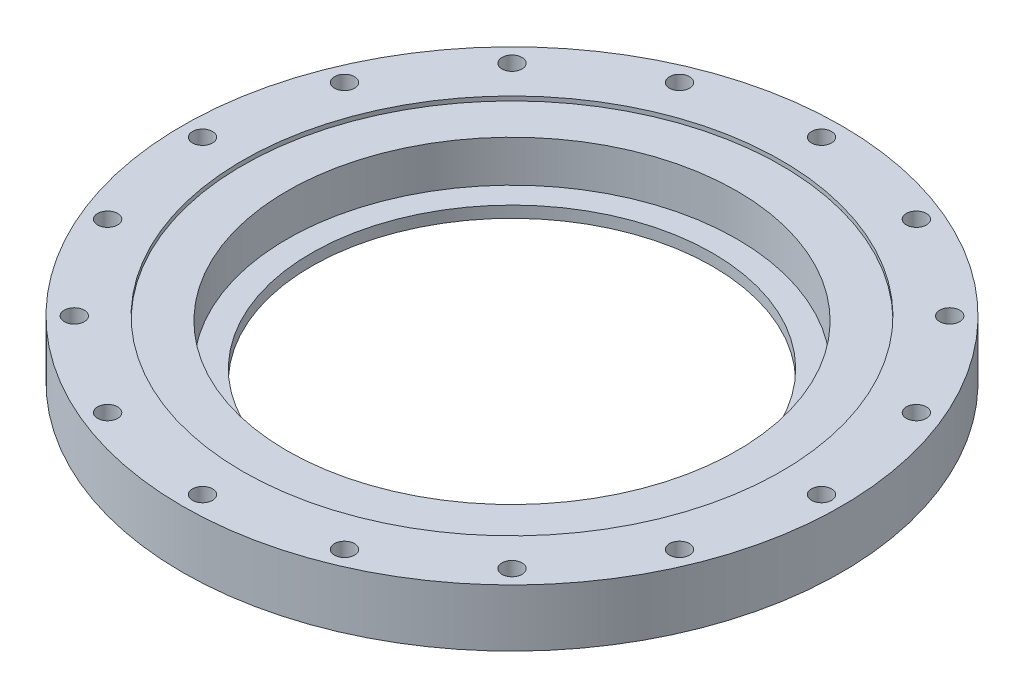
ISO-10303-21;
HEADER;
FILE_DESCRIPTION(('STEP AP214'),'2;1');
FILE_NAME('part.step','',(''),(''),'','','');
FILE_SCHEMA(('AUTOMOTIVE_DESIGN { 1 0 10303 214 1 1 1 1 }'));
ENDSEC;
DATA;
#1=APPLICATION_CONTEXT('core data for automotive mechanical design processes');
#2=APPLICATION_PROTOCOL_DEFINITION('international standard','automotive_design',2000,#1);
#3=PRODUCT_CONTEXT('',#1,'mechanical');
#4=PRODUCT('Part','Part','',(#3));
#5=PRODUCT_RELATED_PRODUCT_CATEGORY('part','',(#4));
#6=PRODUCT_DEFINITION_FORMATION('','',#4);
#7=PRODUCT_DEFINITION_CONTEXT('part definition',#1,'design');
#8=PRODUCT_DEFINITION('design','',#6,#7);
#9=PRODUCT_DEFINITION_SHAPE('','',#8);
#10=(LENGTH_UNIT() NAMED_UNIT(*) SI_UNIT(.MILLI.,.METRE.));
#11=(NAMED_UNIT(*) PLANE_ANGLE_UNIT() SI_UNIT($,.RADIAN.));
#12=(NAMED_UNIT(*) SI_UNIT($,.STERADIAN.) SOLID_ANGLE_UNIT());
#13=UNCERTAINTY_MEASURE_WITH_UNIT(LENGTH_MEASURE(1.E-05),#10,'distance_accuracy_value','');
#14=(GEOMETRIC_REPRESENTATION_CONTEXT(3) GLOBAL_UNCERTAINTY_ASSIGNED_CONTEXT((#13)) GLOBAL_UNIT_ASSIGNED_CONTEXT((#10,
#11,#12)) REPRESENTATION_CONTEXT('',''));
#15=CARTESIAN_POINT('',(0.,0.,0.));
#16=DIRECTION('',(0.,0.,1.));
#17=DIRECTION('',(1.,0.,0.));
#18=AXIS2_PLACEMENT_3D('',#15,#16,#17);
#19=CARTESIAN_POINT('',(0.,10.,0.));
#20=DIRECTION('',(0.,-1.,0.));
#21=DIRECTION('',(0.,0.,-1.));
#22=AXIS2_PLACEMENT_3D('',#19,#20,#21);
#23=CYLINDRICAL_SURFACE('',#22,39.25);
#24=CARTESIAN_POINT('',(0.,9.25,0.));
#25=DIRECTION('',(0.,1.,0.));
#26=DIRECTION('',(0.,0.,1.));
#27=AXIS2_PLACEMENT_3D('',#24,#25,#26);
#28=CIRCLE('',#27,39.25);
#29=CARTESIAN_POINT('',(0.,9.25,39.25));
#30=VERTEX_POINT('',#29);
#31=EDGE_CURVE('E35',#30,#30,#28,.T.);
#32=ORIENTED_EDGE('',*,*,#31,.T.);
#33=EDGE_LOOP('',(#32));
#34=FACE_BOUND('',#33,.T.);
#35=CARTESIAN_POINT('',(0.,2.,0.));
#36=DIRECTION('',(0.,-1.,0.));
#37=DIRECTION('',(0.,0.,-1.));
#38=AXIS2_PLACEMENT_3D('',#35,#36,#37);
#39=CIRCLE('',#38,39.25);
#40=CARTESIAN_POINT('',(0.,2.,-39.25));
#41=VERTEX_POINT('',#40);
#42=EDGE_CURVE('E151',#41,#41,#39,.T.);
#43=ORIENTED_EDGE('',*,*,#42,.T.);
#44=EDGE_LOOP('',(#43));
#45=FACE_BOUND('',#44,.T.);
#46=ADVANCED_FACE('F31',(#34,#45),#23,.F.);
#47=CARTESIAN_POINT('',(0.,10.,0.));
#48=DIRECTION('',(0.,1.,0.));
#49=DIRECTION('',(0.,0.,1.));
#50=AXIS2_PLACEMENT_3D('',#47,#48,#49);
#51=PLANE('',#50);
#52=CARTESIAN_POINT('',(0.,10.,0.));
#53=DIRECTION('',(0.,1.,0.));
#54=DIRECTION('',(0.,0.,1.));
#55=AXIS2_PLACEMENT_3D('',#52,#53,#54);
#56=CIRCLE('',#55,47.);
#57=CARTESIAN_POINT('',(0.,10.,47.));
#58=VERTEX_POINT('',#57);
#59=EDGE_CURVE('E163',#58,#58,#56,.T.);
#60=ORIENTED_EDGE('',*,*,#59,.F.);
#61=EDGE_LOOP('',(#60));
#62=FACE_BOUND('',#61,.T.);
#63=CARTESIAN_POINT('',(0.,10.,-54.));
#64=DIRECTION('',(0.,1.,0.));
#65=DIRECTION('',(0.,0.,1.));
#66=AXIS2_PLACEMENT_3D('',#63,#64,#65);
#67=CIRCLE('',#66,1.75);
#68=CARTESIAN_POINT('',(0.,10.,-52.25));
#69=VERTEX_POINT('',#68);
#70=EDGE_CURVE('E54',#69,#69,#67,.T.);
#71=ORIENTED_EDGE('',*,*,#70,.F.);
#72=EDGE_LOOP('',(#71));
#73=FACE_BOUND('',#72,.T.);
#74=CARTESIAN_POINT('',(20.6649053477149,10.,-49.8894947556095));
#75=DIRECTION('',(0.,1.,0.));
#76=DIRECTION('',(0.,0.,1.));
#77=AXIS2_PLACEMENT_3D('',#74,#75,#76);
#78=CIRCLE('',#77,1.75);
#79=CARTESIAN_POINT('',(20.6649053477149,10.,-48.1394947556095));
#80=VERTEX_POINT('',#79);
#81=EDGE_CURVE('E168',#80,#80,#78,.T.);
#82=ORIENTED_EDGE('',*,*,#81,.F.);
#83=EDGE_LOOP('',(#82));
#84=FACE_BOUND('',#83,.T.);
#85=CARTESIAN_POINT('',(38.1837661840742,10.,-38.1837661840752));
#86=DIRECTION('',(0.,1.,0.));
#87=DIRECTION('',(0.,0.,1.));
#88=AXIS2_PLACEMENT_3D('',#85,#86,#87);
#89=CIRCLE('',#88,1.75);
#90=CARTESIAN_POINT('',(38.1837661840742,10.,-36.4337661840752));
#91=VERTEX_POINT('',#90);
#92=EDGE_CURVE('E171',#91,#91,#89,.T.);
#93=ORIENTED_EDGE('',*,*,#92,.F.);
#94=EDGE_LOOP('',(#93));
#95=FACE_BOUND('',#94,.T.);
#96=CARTESIAN_POINT('',(49.8894947556109,10.,-20.664905347717));
#97=DIRECTION('',(0.,1.,0.));
#98=DIRECTION('',(0.,0.,1.));
#99=AXIS2_PLACEMENT_3D('',#96,#97,#98);
#100=CIRCLE('',#99,1.75);
#101=CARTESIAN_POINT('',(49.8894947556109,10.,-18.914905347717));
#102=VERTEX_POINT('',#101);
#103=EDGE_CURVE('E174',#102,#102,#100,.T.);
#104=ORIENTED_EDGE('',*,*,#103,.F.);
#105=EDGE_LOOP('',(#104));
#106=FACE_BOUND('',#105,.T.);
#107=CARTESIAN_POINT('',(54.0000000000023,10.,-2.29223882478963E-12));
#108=DIRECTION('',(0.,1.,0.));
#109=DIRECTION('',(0.,0.,1.));
#110=AXIS2_PLACEMENT_3D('',#107,#108,#109);
#111=CIRCLE('',#110,1.75);
#112=CARTESIAN_POINT('',(54.0000000000023,10.,1.74999999999771));
#113=VERTEX_POINT('',#112);
#114=EDGE_CURVE('E177',#113,#113,#111,.T.);
#115=ORIENTED_EDGE('',*,*,#114,.F.);
#116=EDGE_LOOP('',(#115));
#117=FACE_BOUND('',#116,.T.);
#118=CARTESIAN_POINT('',(49.8894947556126,10.,20.6649053477127));
#119=DIRECTION('',(0.,1.,0.));
#120=DIRECTION('',(0.,0.,1.));
#121=AXIS2_PLACEMENT_3D('',#118,#119,#120);
#122=CIRCLE('',#121,1.75);
#123=CARTESIAN_POINT('',(49.8894947556126,10.,22.4149053477127));
#124=VERTEX_POINT('',#123);
#125=EDGE_CURVE('E180',#124,#124,#122,.T.);
#126=ORIENTED_EDGE('',*,*,#125,.F.);
#127=EDGE_LOOP('',(#126));
#128=FACE_BOUND('',#127,.T.);
#129=CARTESIAN_POINT('',(38.1837661840775,10.,38.1837661840719));
#130=DIRECTION('',(0.,1.,0.));
#131=DIRECTION('',(0.,0.,1.));
#132=AXIS2_PLACEMENT_3D('',#129,#130,#131);
#133=CIRCLE('',#132,1.75);
#134=CARTESIAN_POINT('',(38.1837661840775,10.,39.9337661840719));
#135=VERTEX_POINT('',#134);
#136=EDGE_CURVE('E183',#135,#135,#133,.T.);
#137=ORIENTED_EDGE('',*,*,#136,.F.);
#138=EDGE_LOOP('',(#137));
#139=FACE_BOUND('',#138,.T.);
#140=CARTESIAN_POINT('',(20.6649053477193,10.,49.8894947556086));
#141=DIRECTION('',(0.,1.,0.));
#142=DIRECTION('',(0.,0.,1.));
#143=AXIS2_PLACEMENT_3D('',#140,#141,#142);
#144=CIRCLE('',#143,1.75);
#145=CARTESIAN_POINT('',(20.6649053477193,10.,51.6394947556086));
#146=VERTEX_POINT('',#145);
#147=EDGE_CURVE('E186',#146,#146,#144,.T.);
#148=ORIENTED_EDGE('',*,*,#147,.F.);
#149=EDGE_LOOP('',(#148));
#150=FACE_BOUND('',#149,.T.);
#151=CARTESIAN_POINT('',(4.58447764957926E-12,10.,54.));
#152=DIRECTION('',(0.,1.,0.));
#153=DIRECTION('',(0.,0.,1.));
#154=AXIS2_PLACEMENT_3D('',#151,#152,#153);
#155=CIRCLE('',#154,1.75);
#156=CARTESIAN_POINT('',(4.58447764957926E-12,10.,55.75));
#157=VERTEX_POINT('',#156);
#158=EDGE_CURVE('E189',#157,#157,#155,.T.);
#159=ORIENTED_EDGE('',*,*,#158,.F.);
#160=EDGE_LOOP('',(#159));
#161=FACE_BOUND('',#160,.T.);
#162=CARTESIAN_POINT('',(-20.6649053477104,10.,49.8894947556104));
#163=DIRECTION('',(0.,1.,0.));
#164=DIRECTION('',(0.,0.,1.));
#165=AXIS2_PLACEMENT_3D('',#162,#163,#164);
#166=CIRCLE('',#165,1.75);
#167=CARTESIAN_POINT('',(-20.6649053477104,10.,51.6394947556104));
#168=VERTEX_POINT('',#167);
#169=EDGE_CURVE('E192',#168,#168,#166,.T.);
#170=ORIENTED_EDGE('',*,*,#169,.F.);
#171=EDGE_LOOP('',(#170));
#172=FACE_BOUND('',#171,.T.);
#173=CARTESIAN_POINT('',(-38.1837661840697,10.,38.1837661840752));
#174=DIRECTION('',(0.,1.,0.));
#175=DIRECTION('',(0.,0.,1.));
#176=AXIS2_PLACEMENT_3D('',#173,#174,#175);
#177=CIRCLE('',#176,1.75);
#178=CARTESIAN_POINT('',(-38.1837661840697,10.,39.9337661840752));
#179=VERTEX_POINT('',#178);
#180=EDGE_CURVE('E195',#179,#179,#177,.T.);
#181=ORIENTED_EDGE('',*,*,#180,.F.);
#182=EDGE_LOOP('',(#181));
#183=FACE_BOUND('',#182,.T.);
#184=CARTESIAN_POINT('',(-49.8894947556063,10.,20.664905347717));
#185=DIRECTION('',(0.,1.,0.));
#186=DIRECTION('',(0.,0.,1.));
#187=AXIS2_PLACEMENT_3D('',#184,#185,#186);
#188=CIRCLE('',#187,1.75);
#189=CARTESIAN_POINT('',(-49.8894947556063,10.,22.414905347717));
#190=VERTEX_POINT('',#189);
#191=EDGE_CURVE('E198',#190,#190,#188,.T.);
#192=ORIENTED_EDGE('',*,*,#191,.F.);
#193=EDGE_LOOP('',(#192));
#194=FACE_BOUND('',#193,.T.);
#195=CARTESIAN_POINT('',(-53.9999999999977,10.,2.29885191750503E-12));
#196=DIRECTION('',(0.,1.,0.));
#197=DIRECTION('',(0.,0.,1.));
#198=AXIS2_PLACEMENT_3D('',#195,#196,#197);
#199=CIRCLE('',#198,1.75);
#200=CARTESIAN_POINT('',(-53.9999999999977,10.,1.7500000000023));
#201=VERTEX_POINT('',#200);
#202=EDGE_CURVE('E201',#201,#201,#199,.T.);
#203=ORIENTED_EDGE('',*,*,#202,.F.);
#204=EDGE_LOOP('',(#203));
#205=FACE_BOUND('',#204,.T.);
#206=CARTESIAN_POINT('',(-49.8894947556081,10.,-20.6649053477127));
#207=DIRECTION('',(0.,1.,0.));
#208=DIRECTION('',(0.,0.,1.));
#209=AXIS2_PLACEMENT_3D('',#206,#207,#208);
#210=CIRCLE('',#209,1.75);
#211=CARTESIAN_POINT('',(-49.8894947556081,10.,-18.9149053477127));
#212=VERTEX_POINT('',#211);
#213=EDGE_CURVE('E204',#212,#212,#210,.T.);
#214=ORIENTED_EDGE('',*,*,#213,.F.);
#215=EDGE_LOOP('',(#214));
#216=FACE_BOUND('',#215,.T.);
#217=CARTESIAN_POINT('',(-38.1837661840729,10.,-38.1837661840719));
#218=DIRECTION('',(0.,1.,0.));
#219=DIRECTION('',(0.,0.,1.));
#220=AXIS2_PLACEMENT_3D('',#217,#218,#219);
#221=CIRCLE('',#220,1.75);
#222=CARTESIAN_POINT('',(-38.1837661840729,10.,-36.4337661840719));
#223=VERTEX_POINT('',#222);
#224=EDGE_CURVE('E206',#223,#223,#221,.T.);
#225=ORIENTED_EDGE('',*,*,#224,.F.);
#226=EDGE_LOOP('',(#225));
#227=FACE_BOUND('',#226,.T.);
#228=CARTESIAN_POINT('',(-20.6649053477147,10.,-49.8894947556086));
#229=DIRECTION('',(0.,1.,0.));
#230=DIRECTION('',(0.,0.,1.));
#231=AXIS2_PLACEMENT_3D('',#228,#229,#230);
#232=CIRCLE('',#231,1.75);
#233=CARTESIAN_POINT('',(-20.6649053477147,10.,-48.1394947556086));
#234=VERTEX_POINT('',#233);
#235=EDGE_CURVE('E47',#234,#234,#232,.T.);
#236=ORIENTED_EDGE('',*,*,#235,.F.);
#237=EDGE_LOOP('',(#236));
#238=FACE_BOUND('',#237,.T.);
#239=CARTESIAN_POINT('',(0.,10.,0.));
#240=DIRECTION('',(0.,1.,0.));
#241=DIRECTION('',(0.,0.,1.));
#242=AXIS2_PLACEMENT_3D('',#239,#240,#241);
#243=CIRCLE('',#242,57.5);
#244=CARTESIAN_POINT('',(0.,10.,57.5));
#245=VERTEX_POINT('',#244);
#246=EDGE_CURVE('E10',#245,#245,#243,.T.);
#247=ORIENTED_EDGE('',*,*,#246,.T.);
#248=EDGE_LOOP('',(#247));
#249=FACE_BOUND('',#248,.T.);
#250=ADVANCED_FACE('F119',(#62,#73,#84,#95,#106,#117,#128,#139,#150,#161,#172,#183,#194,#205,
#216,#227,#238,#249),#51,.T.);
#251=CARTESIAN_POINT('',(0.,0.,0.));
#252=DIRECTION('',(0.,1.,0.));
#253=DIRECTION('',(0.,0.,1.));
#254=AXIS2_PLACEMENT_3D('',#251,#252,#253);
#255=PLANE('',#254);
#256=CARTESIAN_POINT('',(1.57116660247941E-13,0.,45.));
#257=DIRECTION('',(0.,-1.,0.));
#258=DIRECTION('',(0.,0.,-1.));
#259=AXIS2_PLACEMENT_3D('',#256,#257,#258);
#260=CIRCLE('',#259,2.);
#261=CARTESIAN_POINT('',(1.57116660247941E-13,0.,43.));
#262=VERTEX_POINT('',#261);
#263=EDGE_CURVE('E141',#262,#262,#260,.T.);
#264=ORIENTED_EDGE('',*,*,#263,.F.);
#265=EDGE_LOOP('',(#264));
#266=FACE_BOUND('',#265,.T.);
#267=CARTESIAN_POINT('',(38.9711431703025,0.,-22.4999999999985));
#268=DIRECTION('',(0.,-1.,0.));
#269=DIRECTION('',(0.,0.,-1.));
#270=AXIS2_PLACEMENT_3D('',#267,#268,#269);
#271=CIRCLE('',#270,2.);
#272=CARTESIAN_POINT('',(38.9711431703025,0.,-24.4999999999985));
#273=VERTEX_POINT('',#272);
#274=EDGE_CURVE('E145',#273,#273,#271,.T.);
#275=ORIENTED_EDGE('',*,*,#274,.F.);
#276=EDGE_LOOP('',(#275));
#277=FACE_BOUND('',#276,.T.);
#278=CARTESIAN_POINT('',(-38.9711431702969,0.,-22.5000000000015));
#279=DIRECTION('',(0.,-1.,0.));
#280=DIRECTION('',(0.,0.,-1.));
#281=AXIS2_PLACEMENT_3D('',#278,#279,#280);
#282=CIRCLE('',#281,2.);
#283=CARTESIAN_POINT('',(-38.9711431702969,0.,-24.5000000000015));
#284=VERTEX_POINT('',#283);
#285=EDGE_CURVE('E148',#284,#284,#282,.T.);
#286=ORIENTED_EDGE('',*,*,#285,.F.);
#287=EDGE_LOOP('',(#286));
#288=FACE_BOUND('',#287,.T.);
#289=CARTESIAN_POINT('',(0.,0.,-54.));
#290=DIRECTION('',(0.,1.,0.));
#291=DIRECTION('',(0.,0.,1.));
#292=AXIS2_PLACEMENT_3D('',#289,#290,#291);
#293=CIRCLE('',#292,1.75);
#294=CARTESIAN_POINT('',(0.,0.,-52.25));
#295=VERTEX_POINT('',#294);
#296=EDGE_CURVE('E44',#295,#295,#293,.T.);
#297=ORIENTED_EDGE('',*,*,#296,.T.);
#298=EDGE_LOOP('',(#297));
#299=FACE_BOUND('',#298,.T.);
#300=CARTESIAN_POINT('',(20.6649053477149,0.,-49.8894947556095));
#301=DIRECTION('',(0.,1.,0.));
#302=DIRECTION('',(0.,0.,1.));
#303=AXIS2_PLACEMENT_3D('',#300,#301,#302);
#304=CIRCLE('',#303,1.75);
#305=CARTESIAN_POINT('',(20.6649053477149,0.,-48.1394947556095));
#306=VERTEX_POINT('',#305);
#307=EDGE_CURVE('E93',#306,#306,#304,.T.);
#308=ORIENTED_EDGE('',*,*,#307,.T.);
#309=EDGE_LOOP('',(#308));
#310=FACE_BOUND('',#309,.T.);
#311=CARTESIAN_POINT('',(38.1837661840742,0.,-38.1837661840752));
#312=DIRECTION('',(0.,1.,0.));
#313=DIRECTION('',(0.,0.,1.));
#314=AXIS2_PLACEMENT_3D('',#311,#312,#313);
#315=CIRCLE('',#314,1.75);
#316=CARTESIAN_POINT('',(38.1837661840742,0.,-36.4337661840752));
#317=VERTEX_POINT('',#316);
#318=EDGE_CURVE('E90',#317,#317,#315,.T.);
#319=ORIENTED_EDGE('',*,*,#318,.T.);
#320=EDGE_LOOP('',(#319));
#321=FACE_BOUND('',#320,.T.);
#322=CARTESIAN_POINT('',(49.8894947556109,0.,-20.664905347717));
#323=DIRECTION('',(0.,1.,0.));
#324=DIRECTION('',(0.,0.,1.));
#325=AXIS2_PLACEMENT_3D('',#322,#323,#324);
#326=CIRCLE('',#325,1.75);
#327=CARTESIAN_POINT('',(49.8894947556109,0.,-18.914905347717));
#328=VERTEX_POINT('',#327);
#329=EDGE_CURVE('E87',#328,#328,#326,.T.);
#330=ORIENTED_EDGE('',*,*,#329,.T.);
#331=EDGE_LOOP('',(#330));
#332=FACE_BOUND('',#331,.T.);
#333=CARTESIAN_POINT('',(54.0000000000023,0.,-2.29223882478963E-12));
#334=DIRECTION('',(0.,1.,0.));
#335=DIRECTION('',(0.,0.,1.));
#336=AXIS2_PLACEMENT_3D('',#333,#334,#335);
#337=CIRCLE('',#336,1.75);
#338=CARTESIAN_POINT('',(54.0000000000023,0.,1.74999999999771));
#339=VERTEX_POINT('',#338);
#340=EDGE_CURVE('E84',#339,#339,#337,.T.);
#341=ORIENTED_EDGE('',*,*,#340,.T.);
#342=EDGE_LOOP('',(#341));
#343=FACE_BOUND('',#342,.T.);
#344=CARTESIAN_POINT('',(49.8894947556126,0.,20.6649053477127));
#345=DIRECTION('',(0.,1.,0.));
#346=DIRECTION('',(0.,0.,1.));
#347=AXIS2_PLACEMENT_3D('',#344,#345,#346);
#348=CIRCLE('',#347,1.75);
#349=CARTESIAN_POINT('',(49.8894947556126,0.,22.4149053477127));
#350=VERTEX_POINT('',#349);
#351=EDGE_CURVE('E81',#350,#350,#348,.T.);
#352=ORIENTED_EDGE('',*,*,#351,.T.);
#353=EDGE_LOOP('',(#352));
#354=FACE_BOUND('',#353,.T.);
#355=CARTESIAN_POINT('',(38.1837661840775,0.,38.1837661840719));
#356=DIRECTION('',(0.,1.,0.));
#357=DIRECTION('',(0.,0.,1.));
#358=AXIS2_PLACEMENT_3D('',#355,#356,#357);
#359=CIRCLE('',#358,1.75);
#360=CARTESIAN_POINT('',(38.1837661840775,0.,39.9337661840719));
#361=VERTEX_POINT('',#360);
#362=EDGE_CURVE('E78',#361,#361,#359,.T.);
#363=ORIENTED_EDGE('',*,*,#362,.T.);
#364=EDGE_LOOP('',(#363));
#365=FACE_BOUND('',#364,.T.);
#366=CARTESIAN_POINT('',(20.6649053477193,0.,49.8894947556086));
#367=DIRECTION('',(0.,1.,0.));
#368=DIRECTION('',(0.,0.,1.));
#369=AXIS2_PLACEMENT_3D('',#366,#367,#368);
#370=CIRCLE('',#369,1.75);
#371=CARTESIAN_POINT('',(20.6649053477193,0.,51.6394947556086));
#372=VERTEX_POINT('',#371);
#373=EDGE_CURVE('E75',#372,#372,#370,.T.);
#374=ORIENTED_EDGE('',*,*,#373,.T.);
#375=EDGE_LOOP('',(#374));
#376=FACE_BOUND('',#375,.T.);
#377=CARTESIAN_POINT('',(4.58447764957926E-12,0.,54.));
#378=DIRECTION('',(0.,1.,0.));
#379=DIRECTION('',(0.,0.,1.));
#380=AXIS2_PLACEMENT_3D('',#377,#378,#379);
#381=CIRCLE('',#380,1.75);
#382=CARTESIAN_POINT('',(4.58447764957926E-12,0.,55.75));
#383=VERTEX_POINT('',#382);
#384=EDGE_CURVE('E72',#383,#383,#381,.T.);
#385=ORIENTED_EDGE('',*,*,#384,.T.);
#386=EDGE_LOOP('',(#385));
#387=FACE_BOUND('',#386,.T.);
#388=CARTESIAN_POINT('',(-20.6649053477104,0.,49.8894947556104));
#389=DIRECTION('',(0.,1.,0.));
#390=DIRECTION('',(0.,0.,1.));
#391=AXIS2_PLACEMENT_3D('',#388,#389,#390);
#392=CIRCLE('',#391,1.75);
#393=CARTESIAN_POINT('',(-20.6649053477104,0.,51.6394947556104));
#394=VERTEX_POINT('',#393);
#395=EDGE_CURVE('E69',#394,#394,#392,.T.);
#396=ORIENTED_EDGE('',*,*,#395,.T.);
#397=EDGE_LOOP('',(#396));
#398=FACE_BOUND('',#397,.T.);
#399=CARTESIAN_POINT('',(-38.1837661840697,0.,38.1837661840752));
#400=DIRECTION('',(0.,1.,0.));
#401=DIRECTION('',(0.,0.,1.));
#402=AXIS2_PLACEMENT_3D('',#399,#400,#401);
#403=CIRCLE('',#402,1.75);
#404=CARTESIAN_POINT('',(-38.1837661840697,0.,39.9337661840752));
#405=VERTEX_POINT('',#404);
#406=EDGE_CURVE('E66',#405,#405,#403,.T.);
#407=ORIENTED_EDGE('',*,*,#406,.T.);
#408=EDGE_LOOP('',(#407));
#409=FACE_BOUND('',#408,.T.);
#410=CARTESIAN_POINT('',(-49.8894947556063,0.,20.664905347717));
#411=DIRECTION('',(0.,1.,0.));
#412=DIRECTION('',(0.,0.,1.));
#413=AXIS2_PLACEMENT_3D('',#410,#411,#412);
#414=CIRCLE('',#413,1.75);
#415=CARTESIAN_POINT('',(-49.8894947556063,0.,22.414905347717));
#416=VERTEX_POINT('',#415);
#417=EDGE_CURVE('E63',#416,#416,#414,.T.);
#418=ORIENTED_EDGE('',*,*,#417,.T.);
#419=EDGE_LOOP('',(#418));
#420=FACE_BOUND('',#419,.T.);
#421=CARTESIAN_POINT('',(-53.9999999999977,0.,2.29885191750503E-12));
#422=DIRECTION('',(0.,1.,0.));
#423=DIRECTION('',(0.,0.,1.));
#424=AXIS2_PLACEMENT_3D('',#421,#422,#423);
#425=CIRCLE('',#424,1.75);
#426=CARTESIAN_POINT('',(-53.9999999999977,0.,1.7500000000023));
#427=VERTEX_POINT('',#426);
#428=EDGE_CURVE('E60',#427,#427,#425,.T.);
#429=ORIENTED_EDGE('',*,*,#428,.T.);
#430=EDGE_LOOP('',(#429));
#431=FACE_BOUND('',#430,.T.);
#432=CARTESIAN_POINT('',(-49.8894947556081,0.,-20.6649053477127));
#433=DIRECTION('',(0.,1.,0.));
#434=DIRECTION('',(0.,0.,1.));
#435=AXIS2_PLACEMENT_3D('',#432,#433,#434);
#436=CIRCLE('',#435,1.75);
#437=CARTESIAN_POINT('',(-49.8894947556081,0.,-18.9149053477127));
#438=VERTEX_POINT('',#437);
#439=EDGE_CURVE('E57',#438,#438,#436,.T.);
#440=ORIENTED_EDGE('',*,*,#439,.T.);
#441=EDGE_LOOP('',(#440));
#442=FACE_BOUND('',#441,.T.);
#443=CARTESIAN_POINT('',(-38.1837661840729,0.,-38.1837661840719));
#444=DIRECTION('',(0.,1.,0.));
#445=DIRECTION('',(0.,0.,1.));
#446=AXIS2_PLACEMENT_3D('',#443,#444,#445);
#447=CIRCLE('',#446,1.75);
#448=CARTESIAN_POINT('',(-38.1837661840729,0.,-36.4337661840719));
#449=VERTEX_POINT('',#448);
#450=EDGE_CURVE('E53',#449,#449,#447,.T.);
#451=ORIENTED_EDGE('',*,*,#450,.T.);
#452=EDGE_LOOP('',(#451));
#453=FACE_BOUND('',#452,.T.);
#454=CARTESIAN_POINT('',(-20.6649053477147,0.,-49.8894947556086));
#455=DIRECTION('',(0.,1.,0.));
#456=DIRECTION('',(0.,0.,1.));
#457=AXIS2_PLACEMENT_3D('',#454,#455,#456);
#458=CIRCLE('',#457,1.75);
#459=CARTESIAN_POINT('',(-20.6649053477147,0.,-48.1394947556086));
#460=VERTEX_POINT('',#459);
#461=EDGE_CURVE('E50',#460,#460,#458,.T.);
#462=ORIENTED_EDGE('',*,*,#461,.T.);
#463=EDGE_LOOP('',(#462));
#464=FACE_BOUND('',#463,.T.);
#465=CARTESIAN_POINT('',(0.,0.,0.));
#466=DIRECTION('',(0.,1.,0.));
#467=DIRECTION('',(0.,0.,1.));
#468=AXIS2_PLACEMENT_3D('',#465,#466,#467);
#469=CIRCLE('',#468,57.5);
#470=CARTESIAN_POINT('',(0.,0.,57.5));
#471=VERTEX_POINT('',#470);
#472=EDGE_CURVE('E39',#471,#471,#469,.T.);
#473=ORIENTED_EDGE('',*,*,#472,.F.);
#474=EDGE_LOOP('',(#473));
#475=FACE_BOUND('',#474,.T.);
#476=CARTESIAN_POINT('',(0.,0.,0.));
#477=DIRECTION('',(0.,-1.,0.));
#478=DIRECTION('',(0.,0.,-1.));
#479=AXIS2_PLACEMENT_3D('',#476,#477,#478);
#480=CIRCLE('',#479,35.);
#481=CARTESIAN_POINT('',(0.,0.,-35.));
#482=VERTEX_POINT('',#481);
#483=EDGE_CURVE('E270',#482,#482,#480,.T.);
#484=ORIENTED_EDGE('',*,*,#483,.F.);
#485=EDGE_LOOP('',(#484));
#486=FACE_BOUND('',#485,.T.);
#487=ADVANCED_FACE('F98',(#266,#277,#288,#299,#310,#321,#332,#343,#354,#365,#376,#387,#398,#409,
#420,#431,#442,#453,#464,#475,#486),#255,.F.);
#488=CARTESIAN_POINT('',(0.,10.,0.));
#489=DIRECTION('',(0.,-1.,0.));
#490=DIRECTION('',(0.,0.,-1.));
#491=AXIS2_PLACEMENT_3D('',#488,#489,#490);
#492=CYLINDRICAL_SURFACE('',#491,57.5);
#493=ORIENTED_EDGE('',*,*,#246,.F.);
#494=EDGE_LOOP('',(#493));
#495=FACE_BOUND('',#494,.T.);
#496=ORIENTED_EDGE('',*,*,#472,.T.);
#497=EDGE_LOOP('',(#496));
#498=FACE_BOUND('',#497,.T.);
#499=ADVANCED_FACE('F33',(#495,#498),#492,.T.);
#500=CARTESIAN_POINT('',(-20.6649053477147,-7.,-49.8894947556086));
#501=DIRECTION('',(0.,1.,0.));
#502=DIRECTION('',(0.,0.,1.));
#503=AXIS2_PLACEMENT_3D('',#500,#501,#502);
#504=CYLINDRICAL_SURFACE('',#503,1.75);
#505=ORIENTED_EDGE('',*,*,#235,.T.);
#506=EDGE_LOOP('',(#505));
#507=FACE_BOUND('',#506,.T.);
#508=ORIENTED_EDGE('',*,*,#461,.F.);
#509=EDGE_LOOP('',(#508));
#510=FACE_BOUND('',#509,.T.);
#511=ADVANCED_FACE('F130',(#507,#510),#504,.F.);
#512=CARTESIAN_POINT('',(-38.1837661840729,-7.,-38.1837661840719));
#513=DIRECTION('',(0.,1.,0.));
#514=DIRECTION('',(0.,0.,1.));
#515=AXIS2_PLACEMENT_3D('',#512,#513,#514);
#516=CYLINDRICAL_SURFACE('',#515,1.75);
#517=ORIENTED_EDGE('',*,*,#224,.T.);
#518=EDGE_LOOP('',(#517));
#519=FACE_BOUND('',#518,.T.);
#520=ORIENTED_EDGE('',*,*,#450,.F.);
#521=EDGE_LOOP('',(#520));
#522=FACE_BOUND('',#521,.T.);
#523=ADVANCED_FACE('F257',(#519,#522),#516,.F.);
#524=CARTESIAN_POINT('',(-49.8894947556081,-7.,-20.6649053477127));
#525=DIRECTION('',(0.,1.,0.));
#526=DIRECTION('',(0.,0.,1.));
#527=AXIS2_PLACEMENT_3D('',#524,#525,#526);
#528=CYLINDRICAL_SURFACE('',#527,1.75);
#529=ORIENTED_EDGE('',*,*,#213,.T.);
#530=EDGE_LOOP('',(#529));
#531=FACE_BOUND('',#530,.T.);
#532=ORIENTED_EDGE('',*,*,#439,.F.);
#533=EDGE_LOOP('',(#532));
#534=FACE_BOUND('',#533,.T.);
#535=ADVANCED_FACE('F253',(#531,#534),#528,.F.);
#536=CARTESIAN_POINT('',(-53.9999999999977,-7.,2.29885191750503E-12));
#537=DIRECTION('',(0.,1.,0.));
#538=DIRECTION('',(0.,0.,1.));
#539=AXIS2_PLACEMENT_3D('',#536,#537,#538);
#540=CYLINDRICAL_SURFACE('',#539,1.75);
#541=ORIENTED_EDGE('',*,*,#202,.T.);
#542=EDGE_LOOP('',(#541));
#543=FACE_BOUND('',#542,.T.);
#544=ORIENTED_EDGE('',*,*,#428,.F.);
#545=EDGE_LOOP('',(#544));
#546=FACE_BOUND('',#545,.T.);
#547=ADVANCED_FACE('F256',(#543,#546),#540,.F.);
#548=CARTESIAN_POINT('',(-49.8894947556063,-7.,20.664905347717));
#549=DIRECTION('',(0.,1.,0.));
#550=DIRECTION('',(0.,0.,1.));
#551=AXIS2_PLACEMENT_3D('',#548,#549,#550);
#552=CYLINDRICAL_SURFACE('',#551,1.75);
#553=ORIENTED_EDGE('',*,*,#191,.T.);
#554=EDGE_LOOP('',(#553));
#555=FACE_BOUND('',#554,.T.);
#556=ORIENTED_EDGE('',*,*,#417,.F.);
#557=EDGE_LOOP('',(#556));
#558=FACE_BOUND('',#557,.T.);
#559=ADVANCED_FACE('F409',(#555,#558),#552,.F.);
#560=CARTESIAN_POINT('',(-38.1837661840697,-7.,38.1837661840752));
#561=DIRECTION('',(0.,1.,0.));
#562=DIRECTION('',(0.,0.,1.));
#563=AXIS2_PLACEMENT_3D('',#560,#561,#562);
#564=CYLINDRICAL_SURFACE('',#563,1.75);
#565=ORIENTED_EDGE('',*,*,#180,.T.);
#566=EDGE_LOOP('',(#565));
#567=FACE_BOUND('',#566,.T.);
#568=ORIENTED_EDGE('',*,*,#406,.F.);
#569=EDGE_LOOP('',(#568));
#570=FACE_BOUND('',#569,.T.);
#571=ADVANCED_FACE('F418',(#567,#570),#564,.F.);
#572=CARTESIAN_POINT('',(-20.6649053477104,-7.,49.8894947556104));
#573=DIRECTION('',(0.,1.,0.));
#574=DIRECTION('',(0.,0.,1.));
#575=AXIS2_PLACEMENT_3D('',#572,#573,#574);
#576=CYLINDRICAL_SURFACE('',#575,1.75);
#577=ORIENTED_EDGE('',*,*,#169,.T.);
#578=EDGE_LOOP('',(#577));
#579=FACE_BOUND('',#578,.T.);
#580=ORIENTED_EDGE('',*,*,#395,.F.);
#581=EDGE_LOOP('',(#580));
#582=FACE_BOUND('',#581,.T.);
#583=ADVANCED_FACE('F427',(#579,#582),#576,.F.);
#584=CARTESIAN_POINT('',(4.58447764957926E-12,-7.,54.));
#585=DIRECTION('',(0.,1.,0.));
#586=DIRECTION('',(0.,0.,1.));
#587=AXIS2_PLACEMENT_3D('',#584,#585,#586);
#588=CYLINDRICAL_SURFACE('',#587,1.75);
#589=ORIENTED_EDGE('',*,*,#158,.T.);
#590=EDGE_LOOP('',(#589));
#591=FACE_BOUND('',#590,.T.);
#592=ORIENTED_EDGE('',*,*,#384,.F.);
#593=EDGE_LOOP('',(#592));
#594=FACE_BOUND('',#593,.T.);
#595=ADVANCED_FACE('F436',(#591,#594),#588,.F.);
#596=CARTESIAN_POINT('',(20.6649053477193,-7.,49.8894947556086));
#597=DIRECTION('',(0.,1.,0.));
#598=DIRECTION('',(0.,0.,1.));
#599=AXIS2_PLACEMENT_3D('',#596,#597,#598);
#600=CYLINDRICAL_SURFACE('',#599,1.75);
#601=ORIENTED_EDGE('',*,*,#147,.T.);
#602=EDGE_LOOP('',(#601));
#603=FACE_BOUND('',#602,.T.);
#604=ORIENTED_EDGE('',*,*,#373,.F.);
#605=EDGE_LOOP('',(#604));
#606=FACE_BOUND('',#605,.T.);
#607=ADVANCED_FACE('F445',(#603,#606),#600,.F.);
#608=CARTESIAN_POINT('',(38.1837661840775,-7.,38.1837661840719));
#609=DIRECTION('',(0.,1.,0.));
#610=DIRECTION('',(0.,0.,1.));
#611=AXIS2_PLACEMENT_3D('',#608,#609,#610);
#612=CYLINDRICAL_SURFACE('',#611,1.75);
#613=ORIENTED_EDGE('',*,*,#136,.T.);
#614=EDGE_LOOP('',(#613));
#615=FACE_BOUND('',#614,.T.);
#616=ORIENTED_EDGE('',*,*,#362,.F.);
#617=EDGE_LOOP('',(#616));
#618=FACE_BOUND('',#617,.T.);
#619=ADVANCED_FACE('F454',(#615,#618),#612,.F.);
#620=CARTESIAN_POINT('',(49.8894947556126,-7.,20.6649053477127));
#621=DIRECTION('',(0.,1.,0.));
#622=DIRECTION('',(0.,0.,1.));
#623=AXIS2_PLACEMENT_3D('',#620,#621,#622);
#624=CYLINDRICAL_SURFACE('',#623,1.75);
#625=ORIENTED_EDGE('',*,*,#125,.T.);
#626=EDGE_LOOP('',(#625));
#627=FACE_BOUND('',#626,.T.);
#628=ORIENTED_EDGE('',*,*,#351,.F.);
#629=EDGE_LOOP('',(#628));
#630=FACE_BOUND('',#629,.T.);
#631=ADVANCED_FACE('F463',(#627,#630),#624,.F.);
#632=CARTESIAN_POINT('',(54.0000000000023,-7.,-2.29223882478963E-12));
#633=DIRECTION('',(0.,1.,0.));
#634=DIRECTION('',(0.,0.,1.));
#635=AXIS2_PLACEMENT_3D('',#632,#633,#634);
#636=CYLINDRICAL_SURFACE('',#635,1.75);
#637=ORIENTED_EDGE('',*,*,#114,.T.);
#638=EDGE_LOOP('',(#637));
#639=FACE_BOUND('',#638,.T.);
#640=ORIENTED_EDGE('',*,*,#340,.F.);
#641=EDGE_LOOP('',(#640));
#642=FACE_BOUND('',#641,.T.);
#643=ADVANCED_FACE('F472',(#639,#642),#636,.F.);
#644=CARTESIAN_POINT('',(49.8894947556109,-7.,-20.664905347717));
#645=DIRECTION('',(0.,1.,0.));
#646=DIRECTION('',(0.,0.,1.));
#647=AXIS2_PLACEMENT_3D('',#644,#645,#646);
#648=CYLINDRICAL_SURFACE('',#647,1.75);
#649=ORIENTED_EDGE('',*,*,#103,.T.);
#650=EDGE_LOOP('',(#649));
#651=FACE_BOUND('',#650,.T.);
#652=ORIENTED_EDGE('',*,*,#329,.F.);
#653=EDGE_LOOP('',(#652));
#654=FACE_BOUND('',#653,.T.);
#655=ADVANCED_FACE('F481',(#651,#654),#648,.F.);
#656=CARTESIAN_POINT('',(38.1837661840742,-7.,-38.1837661840752));
#657=DIRECTION('',(0.,1.,0.));
#658=DIRECTION('',(0.,0.,1.));
#659=AXIS2_PLACEMENT_3D('',#656,#657,#658);
#660=CYLINDRICAL_SURFACE('',#659,1.75);
#661=ORIENTED_EDGE('',*,*,#92,.T.);
#662=EDGE_LOOP('',(#661));
#663=FACE_BOUND('',#662,.T.);
#664=ORIENTED_EDGE('',*,*,#318,.F.);
#665=EDGE_LOOP('',(#664));
#666=FACE_BOUND('',#665,.T.);
#667=ADVANCED_FACE('F114',(#663,#666),#660,.F.);
#668=CARTESIAN_POINT('',(20.6649053477149,-7.,-49.8894947556095));
#669=DIRECTION('',(0.,1.,0.));
#670=DIRECTION('',(0.,0.,1.));
#671=AXIS2_PLACEMENT_3D('',#668,#669,#670);
#672=CYLINDRICAL_SURFACE('',#671,1.75);
#673=ORIENTED_EDGE('',*,*,#81,.T.);
#674=EDGE_LOOP('',(#673));
#675=FACE_BOUND('',#674,.T.);
#676=ORIENTED_EDGE('',*,*,#307,.F.);
#677=EDGE_LOOP('',(#676));
#678=FACE_BOUND('',#677,.T.);
#679=ADVANCED_FACE('F104',(#675,#678),#672,.F.);
#680=CARTESIAN_POINT('',(0.,-7.,-54.));
#681=DIRECTION('',(0.,1.,0.));
#682=DIRECTION('',(0.,0.,1.));
#683=AXIS2_PLACEMENT_3D('',#680,#681,#682);
#684=CYLINDRICAL_SURFACE('',#683,1.75);
#685=ORIENTED_EDGE('',*,*,#70,.T.);
#686=EDGE_LOOP('',(#685));
#687=FACE_BOUND('',#686,.T.);
#688=ORIENTED_EDGE('',*,*,#296,.F.);
#689=EDGE_LOOP('',(#688));
#690=FACE_BOUND('',#689,.T.);
#691=ADVANCED_FACE('F101',(#687,#690),#684,.F.);
#692=CARTESIAN_POINT('',(0.,9.25,0.));
#693=DIRECTION('',(0.,1.,0.));
#694=DIRECTION('',(0.,0.,1.));
#695=AXIS2_PLACEMENT_3D('',#692,#693,#694);
#696=CYLINDRICAL_SURFACE('',#695,47.);
#697=CARTESIAN_POINT('',(0.,9.25,0.));
#698=DIRECTION('',(0.,1.,0.));
#699=DIRECTION('',(0.,0.,1.));
#700=AXIS2_PLACEMENT_3D('',#697,#698,#699);
#701=CIRCLE('',#700,47.);
#702=CARTESIAN_POINT('',(0.,9.25,47.));
#703=VERTEX_POINT('',#702);
#704=EDGE_CURVE('E160',#703,#703,#701,.T.);
#705=ORIENTED_EDGE('',*,*,#704,.F.);
#706=EDGE_LOOP('',(#705));
#707=FACE_BOUND('',#706,.T.);
#708=ORIENTED_EDGE('',*,*,#59,.T.);
#709=EDGE_LOOP('',(#708));
#710=FACE_BOUND('',#709,.T.);
#711=ADVANCED_FACE('F103',(#707,#710),#696,.F.);
#712=CARTESIAN_POINT('',(0.,9.25,0.));
#713=DIRECTION('',(0.,1.,0.));
#714=DIRECTION('',(0.,0.,1.));
#715=AXIS2_PLACEMENT_3D('',#712,#713,#714);
#716=PLANE('',#715);
#717=ORIENTED_EDGE('',*,*,#31,.F.);
#718=EDGE_LOOP('',(#717));
#719=FACE_BOUND('',#718,.T.);
#720=ORIENTED_EDGE('',*,*,#704,.T.);
#721=EDGE_LOOP('',(#720));
#722=FACE_BOUND('',#721,.T.);
#723=ADVANCED_FACE('F111',(#719,#722),#716,.T.);
#724=CARTESIAN_POINT('',(-38.9711431702969,5.,-22.5000000000015));
#725=DIRECTION('',(0.,-1.,0.));
#726=DIRECTION('',(0.,0.,-1.));
#727=AXIS2_PLACEMENT_3D('',#724,#725,#726);
#728=CYLINDRICAL_SURFACE('',#727,2.);
#729=CARTESIAN_POINT('',(-38.9711431702969,5.,-22.5000000000015));
#730=DIRECTION('',(0.,-1.,0.));
#731=DIRECTION('',(0.,0.,-1.));
#732=AXIS2_PLACEMENT_3D('',#729,#730,#731);
#733=CIRCLE('',#732,2.);
#734=CARTESIAN_POINT('',(-38.9711431702969,5.,-24.5000000000015));
#735=VERTEX_POINT('',#734);
#736=EDGE_CURVE('E150',#735,#735,#733,.T.);
#737=ORIENTED_EDGE('',*,*,#736,.F.);
#738=EDGE_LOOP('',(#737));
#739=FACE_BOUND('',#738,.T.);
#740=ORIENTED_EDGE('',*,*,#285,.T.);
#741=EDGE_LOOP('',(#740));
#742=FACE_BOUND('',#741,.T.);
#743=ADVANCED_FACE('F217',(#739,#742),#728,.F.);
#744=CARTESIAN_POINT('',(-38.9711431702969,5.,-22.5000000000015));
#745=DIRECTION('',(0.,-1.,0.));
#746=DIRECTION('',(0.,0.,-1.));
#747=AXIS2_PLACEMENT_3D('',#744,#745,#746);
#748=PLANE('',#747);
#749=ORIENTED_EDGE('',*,*,#736,.T.);
#750=EDGE_LOOP('',(#749));
#751=FACE_BOUND('',#750,.T.);
#752=ADVANCED_FACE('F285',(#751),#748,.T.);
#753=CARTESIAN_POINT('',(38.9711431703025,5.,-22.4999999999985));
#754=DIRECTION('',(0.,-1.,0.));
#755=DIRECTION('',(0.,0.,-1.));
#756=AXIS2_PLACEMENT_3D('',#753,#754,#755);
#757=CYLINDRICAL_SURFACE('',#756,2.);
#758=CARTESIAN_POINT('',(38.9711431703025,5.,-22.4999999999985));
#759=DIRECTION('',(0.,-1.,0.));
#760=DIRECTION('',(0.,0.,-1.));
#761=AXIS2_PLACEMENT_3D('',#758,#759,#760);
#762=CIRCLE('',#761,2.);
#763=CARTESIAN_POINT('',(38.9711431703025,5.,-24.4999999999985));
#764=VERTEX_POINT('',#763);
#765=EDGE_CURVE('E279',#764,#764,#762,.T.);
#766=ORIENTED_EDGE('',*,*,#765,.F.);
#767=EDGE_LOOP('',(#766));
#768=FACE_BOUND('',#767,.T.);
#769=ORIENTED_EDGE('',*,*,#274,.T.);
#770=EDGE_LOOP('',(#769));
#771=FACE_BOUND('',#770,.T.);
#772=ADVANCED_FACE('F282',(#768,#771),#757,.F.);
#773=CARTESIAN_POINT('',(38.9711431703025,5.,-22.4999999999985));
#774=DIRECTION('',(0.,-1.,0.));
#775=DIRECTION('',(0.,0.,-1.));
#776=AXIS2_PLACEMENT_3D('',#773,#774,#775);
#777=PLANE('',#776);
#778=ORIENTED_EDGE('',*,*,#765,.T.);
#779=EDGE_LOOP('',(#778));
#780=FACE_BOUND('',#779,.T.);
#781=ADVANCED_FACE('F284',(#780),#777,.T.);
#782=CARTESIAN_POINT('',(1.57116660247941E-13,5.,45.));
#783=DIRECTION('',(0.,-1.,0.));
#784=DIRECTION('',(0.,0.,-1.));
#785=AXIS2_PLACEMENT_3D('',#782,#783,#784);
#786=CYLINDRICAL_SURFACE('',#785,2.);
#787=CARTESIAN_POINT('',(1.57116660247941E-13,5.,45.));
#788=DIRECTION('',(0.,-1.,0.));
#789=DIRECTION('',(0.,0.,-1.));
#790=AXIS2_PLACEMENT_3D('',#787,#788,#789);
#791=CIRCLE('',#790,2.);
#792=CARTESIAN_POINT('',(1.57116660247941E-13,5.,43.));
#793=VERTEX_POINT('',#792);
#794=EDGE_CURVE('E166',#793,#793,#791,.T.);
#795=ORIENTED_EDGE('',*,*,#794,.F.);
#796=EDGE_LOOP('',(#795));
#797=FACE_BOUND('',#796,.T.);
#798=ORIENTED_EDGE('',*,*,#263,.T.);
#799=EDGE_LOOP('',(#798));
#800=FACE_BOUND('',#799,.T.);
#801=ADVANCED_FACE('F292',(#797,#800),#786,.F.);
#802=CARTESIAN_POINT('',(1.57116660247941E-13,5.,45.));
#803=DIRECTION('',(0.,-1.,0.));
#804=DIRECTION('',(0.,0.,-1.));
#805=AXIS2_PLACEMENT_3D('',#802,#803,#804);
#806=PLANE('',#805);
#807=ORIENTED_EDGE('',*,*,#794,.T.);
#808=EDGE_LOOP('',(#807));
#809=FACE_BOUND('',#808,.T.);
#810=ADVANCED_FACE('F330',(#809),#806,.T.);
#811=CARTESIAN_POINT('',(0.,2.,0.));
#812=DIRECTION('',(0.,-1.,0.));
#813=DIRECTION('',(0.,0.,-1.));
#814=AXIS2_PLACEMENT_3D('',#811,#812,#813);
#815=PLANE('',#814);
#816=CARTESIAN_POINT('',(0.,2.,0.));
#817=DIRECTION('',(0.,-1.,0.));
#818=DIRECTION('',(0.,0.,-1.));
#819=AXIS2_PLACEMENT_3D('',#816,#817,#818);
#820=CIRCLE('',#819,35.);
#821=CARTESIAN_POINT('',(0.,2.,-35.));
#822=VERTEX_POINT('',#821);
#823=EDGE_CURVE('E156',#822,#822,#820,.T.);
#824=ORIENTED_EDGE('',*,*,#823,.T.);
#825=EDGE_LOOP('',(#824));
#826=FACE_BOUND('',#825,.T.);
#827=ORIENTED_EDGE('',*,*,#42,.F.);
#828=EDGE_LOOP('',(#827));
#829=FACE_BOUND('',#828,.T.);
#830=ADVANCED_FACE('F338',(#826,#829),#815,.F.);
#831=CARTESIAN_POINT('',(0.,2.,0.));
#832=DIRECTION('',(0.,-1.,0.));
#833=DIRECTION('',(0.,0.,-1.));
#834=AXIS2_PLACEMENT_3D('',#831,#832,#833);
#835=CYLINDRICAL_SURFACE('',#834,35.);
#836=ORIENTED_EDGE('',*,*,#823,.F.);
#837=EDGE_LOOP('',(#836));
#838=FACE_BOUND('',#837,.T.);
#839=ORIENTED_EDGE('',*,*,#483,.T.);
#840=EDGE_LOOP('',(#839));
#841=FACE_BOUND('',#840,.T.);
#842=ADVANCED_FACE('F358',(#838,#841),#835,.F.);
#843=CLOSED_SHELL('',(#46,#250,#487,#499,#511,#523,#535,#547,#559,#571,#583,#595,#607,#619,#631,
#643,#655,#667,#679,#691,#711,#723,#743,#752,#772,#781,#801,#810,#830,#842));
#844=MANIFOLD_SOLID_BREP('B2',#843);
#845=ADVANCED_BREP_SHAPE_REPRESENTATION('',(#18,#844),#14);
#846=SHAPE_DEFINITION_REPRESENTATION(#9,#845);
ENDSEC;
END-ISO-10303-21;
